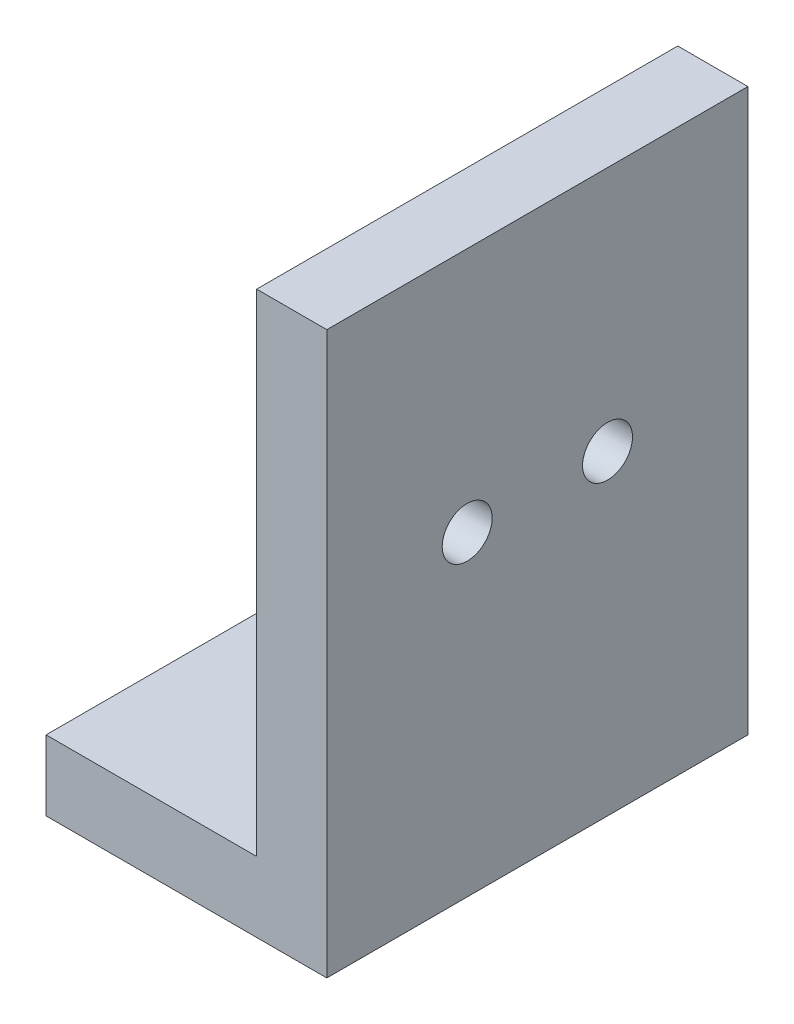
ISO-10303-21;
HEADER;
FILE_DESCRIPTION(('STEP AP214'),'2;1');
FILE_NAME('part.step','',(''),(''),'','','');
FILE_SCHEMA(('AUTOMOTIVE_DESIGN { 1 0 10303 214 1 1 1 1 }'));
ENDSEC;
DATA;
#1=APPLICATION_CONTEXT('core data for automotive mechanical design processes');
#2=APPLICATION_PROTOCOL_DEFINITION('international standard','automotive_design',2000,#1);
#3=PRODUCT_CONTEXT('',#1,'mechanical');
#4=PRODUCT('Part','Part','',(#3));
#5=PRODUCT_RELATED_PRODUCT_CATEGORY('part','',(#4));
#6=PRODUCT_DEFINITION_FORMATION('','',#4);
#7=PRODUCT_DEFINITION_CONTEXT('part definition',#1,'design');
#8=PRODUCT_DEFINITION('design','',#6,#7);
#9=PRODUCT_DEFINITION_SHAPE('','',#8);
#10=(LENGTH_UNIT() NAMED_UNIT(*) SI_UNIT(.MILLI.,.METRE.));
#11=(NAMED_UNIT(*) PLANE_ANGLE_UNIT() SI_UNIT($,.RADIAN.));
#12=(NAMED_UNIT(*) SI_UNIT($,.STERADIAN.) SOLID_ANGLE_UNIT());
#13=UNCERTAINTY_MEASURE_WITH_UNIT(LENGTH_MEASURE(1.E-05),#10,'distance_accuracy_value','');
#14=(GEOMETRIC_REPRESENTATION_CONTEXT(3) GLOBAL_UNCERTAINTY_ASSIGNED_CONTEXT((#13)) GLOBAL_UNIT_ASSIGNED_CONTEXT((#10,
#11,#12)) REPRESENTATION_CONTEXT('',''));
#15=CARTESIAN_POINT('',(0.,0.,0.));
#16=DIRECTION('',(0.,0.,1.));
#17=DIRECTION('',(1.,0.,0.));
#18=AXIS2_PLACEMENT_3D('',#15,#16,#17);
#19=CARTESIAN_POINT('',(0.,0.,19.05));
#20=DIRECTION('',(0.,1.,0.));
#21=DIRECTION('',(0.,0.,1.));
#22=AXIS2_PLACEMENT_3D('',#19,#20,#21);
#23=PLANE('',#22);
#24=CARTESIAN_POINT('',(4.7625,0.,6.35));
#25=DIRECTION('',(0.,1.,0.));
#26=DIRECTION('',(0.,0.,1.));
#27=AXIS2_PLACEMENT_3D('',#24,#25,#26);
#28=CIRCLE('',#27,1.13029999999999);
#29=CARTESIAN_POINT('',(4.7625,0.,7.48029999999999));
#30=VERTEX_POINT('',#29);
#31=EDGE_CURVE('E164',#30,#30,#28,.T.);
#32=ORIENTED_EDGE('',*,*,#31,.T.);
#33=EDGE_LOOP('',(#32));
#34=FACE_BOUND('',#33,.T.);
#35=CARTESIAN_POINT('',(4.7625,0.,12.7));
#36=DIRECTION('',(0.,1.,0.));
#37=DIRECTION('',(0.,0.,1.));
#38=AXIS2_PLACEMENT_3D('',#35,#36,#37);
#39=CIRCLE('',#38,1.13029999999999);
#40=CARTESIAN_POINT('',(4.7625,0.,13.8303));
#41=VERTEX_POINT('',#40);
#42=EDGE_CURVE('E167',#41,#41,#39,.T.);
#43=ORIENTED_EDGE('',*,*,#42,.T.);
#44=EDGE_LOOP('',(#43));
#45=FACE_BOUND('',#44,.T.);
#46=DIRECTION('',(1.,0.,0.));
#47=VECTOR('',#46,1.);
#48=CARTESIAN_POINT('',(0.,0.,0.));
#49=LINE('',#48,#47);
#50=CARTESIAN_POINT('',(0.,0.,0.));
#51=VERTEX_POINT('',#50);
#52=CARTESIAN_POINT('',(12.7,0.,0.));
#53=VERTEX_POINT('',#52);
#54=EDGE_CURVE('E117',#51,#53,#49,.T.);
#55=ORIENTED_EDGE('',*,*,#54,.T.);
#56=DIRECTION('',(0.,0.,-1.));
#57=VECTOR('',#56,1.);
#58=CARTESIAN_POINT('',(12.7,0.,19.05));
#59=LINE('',#58,#57);
#60=CARTESIAN_POINT('',(12.7,0.,19.05));
#61=VERTEX_POINT('',#60);
#62=EDGE_CURVE('E11',#61,#53,#59,.T.);
#63=ORIENTED_EDGE('',*,*,#62,.F.);
#64=DIRECTION('',(1.,0.,0.));
#65=VECTOR('',#64,1.);
#66=CARTESIAN_POINT('',(0.,0.,19.05));
#67=LINE('',#66,#65);
#68=CARTESIAN_POINT('',(0.,0.,19.05));
#69=VERTEX_POINT('',#68);
#70=EDGE_CURVE('E128',#69,#61,#67,.T.);
#71=ORIENTED_EDGE('',*,*,#70,.F.);
#72=DIRECTION('',(0.,0.,-1.));
#73=VECTOR('',#72,1.);
#74=CARTESIAN_POINT('',(0.,0.,19.05));
#75=LINE('',#74,#73);
#76=EDGE_CURVE('E113',#69,#51,#75,.T.);
#77=ORIENTED_EDGE('',*,*,#76,.T.);
#78=EDGE_LOOP('',(#55,#63,#71,#77));
#79=FACE_BOUND('',#78,.T.);
#80=ADVANCED_FACE('F33',(#34,#45,#79),#23,.F.);
#81=CARTESIAN_POINT('',(12.7,0.,19.05));
#82=DIRECTION('',(-1.,0.,0.));
#83=DIRECTION('',(0.,0.,1.));
#84=AXIS2_PLACEMENT_3D('',#81,#82,#83);
#85=PLANE('',#84);
#86=CARTESIAN_POINT('',(12.7,14.2875,6.35));
#87=DIRECTION('',(-1.,0.,0.));
#88=DIRECTION('',(0.,0.,1.));
#89=AXIS2_PLACEMENT_3D('',#86,#87,#88);
#90=CIRCLE('',#89,1.1303);
#91=CARTESIAN_POINT('',(12.7,14.2875,7.4803));
#92=VERTEX_POINT('',#91);
#93=EDGE_CURVE('E173',#92,#92,#90,.T.);
#94=ORIENTED_EDGE('',*,*,#93,.T.);
#95=EDGE_LOOP('',(#94));
#96=FACE_BOUND('',#95,.T.);
#97=CARTESIAN_POINT('',(12.7,14.2875,12.7));
#98=DIRECTION('',(-1.,0.,0.));
#99=DIRECTION('',(0.,0.,1.));
#100=AXIS2_PLACEMENT_3D('',#97,#98,#99);
#101=CIRCLE('',#100,1.1303);
#102=CARTESIAN_POINT('',(12.7,14.2875,13.8303));
#103=VERTEX_POINT('',#102);
#104=EDGE_CURVE('E121',#103,#103,#101,.T.);
#105=ORIENTED_EDGE('',*,*,#104,.T.);
#106=EDGE_LOOP('',(#105));
#107=FACE_BOUND('',#106,.T.);
#108=DIRECTION('',(0.,1.,0.));
#109=VECTOR('',#108,1.);
#110=CARTESIAN_POINT('',(12.7,0.,0.));
#111=LINE('',#110,#109);
#112=CARTESIAN_POINT('',(12.7,25.4,0.));
#113=VERTEX_POINT('',#112);
#114=EDGE_CURVE('E120',#53,#113,#111,.T.);
#115=ORIENTED_EDGE('',*,*,#114,.T.);
#116=DIRECTION('',(0.,0.,-1.));
#117=VECTOR('',#116,1.);
#118=CARTESIAN_POINT('',(12.7,25.4,19.05));
#119=LINE('',#118,#117);
#120=CARTESIAN_POINT('',(12.7,25.4,19.05));
#121=VERTEX_POINT('',#120);
#122=EDGE_CURVE('E41',#121,#113,#119,.T.);
#123=ORIENTED_EDGE('',*,*,#122,.F.);
#124=DIRECTION('',(0.,1.,0.));
#125=VECTOR('',#124,1.);
#126=CARTESIAN_POINT('',(12.7,0.,19.05));
#127=LINE('',#126,#125);
#128=EDGE_CURVE('E86',#61,#121,#127,.T.);
#129=ORIENTED_EDGE('',*,*,#128,.F.);
#130=ORIENTED_EDGE('',*,*,#62,.T.);
#131=EDGE_LOOP('',(#115,#123,#129,#130));
#132=FACE_BOUND('',#131,.T.);
#133=ADVANCED_FACE('F154',(#96,#107,#132),#85,.F.);
#134=CARTESIAN_POINT('',(12.7,25.4,19.05));
#135=DIRECTION('',(0.,-1.,0.));
#136=DIRECTION('',(0.,0.,-1.));
#137=AXIS2_PLACEMENT_3D('',#134,#135,#136);
#138=PLANE('',#137);
#139=DIRECTION('',(-1.,0.,0.));
#140=VECTOR('',#139,1.);
#141=CARTESIAN_POINT('',(12.7,25.4,0.));
#142=LINE('',#141,#140);
#143=CARTESIAN_POINT('',(9.525,25.4,0.));
#144=VERTEX_POINT('',#143);
#145=EDGE_CURVE('E123',#113,#144,#142,.T.);
#146=ORIENTED_EDGE('',*,*,#145,.T.);
#147=DIRECTION('',(0.,0.,-1.));
#148=VECTOR('',#147,1.);
#149=CARTESIAN_POINT('',(9.525,25.4,19.05));
#150=LINE('',#149,#148);
#151=CARTESIAN_POINT('',(9.525,25.4,19.05));
#152=VERTEX_POINT('',#151);
#153=EDGE_CURVE('E108',#152,#144,#150,.T.);
#154=ORIENTED_EDGE('',*,*,#153,.F.);
#155=DIRECTION('',(-1.,0.,0.));
#156=VECTOR('',#155,1.);
#157=CARTESIAN_POINT('',(12.7,25.4,19.05));
#158=LINE('',#157,#156);
#159=EDGE_CURVE('E99',#121,#152,#158,.T.);
#160=ORIENTED_EDGE('',*,*,#159,.F.);
#161=ORIENTED_EDGE('',*,*,#122,.T.);
#162=EDGE_LOOP('',(#146,#154,#160,#161));
#163=FACE_BOUND('',#162,.T.);
#164=ADVANCED_FACE('F134',(#163),#138,.F.);
#165=CARTESIAN_POINT('',(9.525,25.4,19.05));
#166=DIRECTION('',(1.,0.,0.));
#167=DIRECTION('',(0.,1.,0.));
#168=AXIS2_PLACEMENT_3D('',#165,#166,#167);
#169=PLANE('',#168);
#170=CARTESIAN_POINT('',(9.525,14.2875,6.35));
#171=DIRECTION('',(-1.,0.,0.));
#172=DIRECTION('',(0.,0.,1.));
#173=AXIS2_PLACEMENT_3D('',#170,#171,#172);
#174=CIRCLE('',#173,1.1303);
#175=CARTESIAN_POINT('',(9.525,14.2875,7.4803));
#176=VERTEX_POINT('',#175);
#177=EDGE_CURVE('E169',#176,#176,#174,.T.);
#178=ORIENTED_EDGE('',*,*,#177,.F.);
#179=EDGE_LOOP('',(#178));
#180=FACE_BOUND('',#179,.T.);
#181=CARTESIAN_POINT('',(9.525,14.2875,12.7));
#182=DIRECTION('',(-1.,0.,0.));
#183=DIRECTION('',(0.,0.,1.));
#184=AXIS2_PLACEMENT_3D('',#181,#182,#183);
#185=CIRCLE('',#184,1.1303);
#186=CARTESIAN_POINT('',(9.525,14.2875,13.8303));
#187=VERTEX_POINT('',#186);
#188=EDGE_CURVE('E181',#187,#187,#185,.T.);
#189=ORIENTED_EDGE('',*,*,#188,.F.);
#190=EDGE_LOOP('',(#189));
#191=FACE_BOUND('',#190,.T.);
#192=DIRECTION('',(0.,-1.,0.));
#193=VECTOR('',#192,1.);
#194=CARTESIAN_POINT('',(9.525,25.4,0.));
#195=LINE('',#194,#193);
#196=CARTESIAN_POINT('',(9.525,3.175,0.));
#197=VERTEX_POINT('',#196);
#198=EDGE_CURVE('E107',#144,#197,#195,.T.);
#199=ORIENTED_EDGE('',*,*,#198,.T.);
#200=DIRECTION('',(0.,0.,-1.));
#201=VECTOR('',#200,1.);
#202=CARTESIAN_POINT('',(9.525,3.175,19.05));
#203=LINE('',#202,#201);
#204=CARTESIAN_POINT('',(9.525,3.175,19.05));
#205=VERTEX_POINT('',#204);
#206=EDGE_CURVE('E104',#205,#197,#203,.T.);
#207=ORIENTED_EDGE('',*,*,#206,.F.);
#208=DIRECTION('',(0.,-1.,0.));
#209=VECTOR('',#208,1.);
#210=CARTESIAN_POINT('',(9.525,25.4,19.05));
#211=LINE('',#210,#209);
#212=EDGE_CURVE('E93',#152,#205,#211,.T.);
#213=ORIENTED_EDGE('',*,*,#212,.F.);
#214=ORIENTED_EDGE('',*,*,#153,.T.);
#215=EDGE_LOOP('',(#199,#207,#213,#214));
#216=FACE_BOUND('',#215,.T.);
#217=ADVANCED_FACE('F105',(#180,#191,#216),#169,.F.);
#218=CARTESIAN_POINT('',(9.525,3.175,19.05));
#219=DIRECTION('',(0.,-1.,0.));
#220=DIRECTION('',(1.,0.,0.));
#221=AXIS2_PLACEMENT_3D('',#218,#219,#220);
#222=PLANE('',#221);
#223=CARTESIAN_POINT('',(4.7625,3.175,6.35));
#224=DIRECTION('',(0.,1.,0.));
#225=DIRECTION('',(0.,0.,1.));
#226=AXIS2_PLACEMENT_3D('',#223,#224,#225);
#227=CIRCLE('',#226,1.13029999999999);
#228=CARTESIAN_POINT('',(4.7625,3.175,7.48029999999999));
#229=VERTEX_POINT('',#228);
#230=EDGE_CURVE('E214',#229,#229,#227,.T.);
#231=ORIENTED_EDGE('',*,*,#230,.F.);
#232=EDGE_LOOP('',(#231));
#233=FACE_BOUND('',#232,.T.);
#234=CARTESIAN_POINT('',(4.7625,3.175,12.7));
#235=DIRECTION('',(0.,1.,0.));
#236=DIRECTION('',(0.,0.,1.));
#237=AXIS2_PLACEMENT_3D('',#234,#235,#236);
#238=CIRCLE('',#237,1.13029999999999);
#239=CARTESIAN_POINT('',(4.7625,3.175,13.8303));
#240=VERTEX_POINT('',#239);
#241=EDGE_CURVE('E170',#240,#240,#238,.T.);
#242=ORIENTED_EDGE('',*,*,#241,.F.);
#243=EDGE_LOOP('',(#242));
#244=FACE_BOUND('',#243,.T.);
#245=DIRECTION('',(-1.,0.,0.));
#246=VECTOR('',#245,1.);
#247=CARTESIAN_POINT('',(9.525,3.175,0.));
#248=LINE('',#247,#246);
#249=CARTESIAN_POINT('',(0.,3.175,0.));
#250=VERTEX_POINT('',#249);
#251=EDGE_CURVE('E72',#197,#250,#248,.T.);
#252=ORIENTED_EDGE('',*,*,#251,.T.);
#253=DIRECTION('',(0.,0.,-1.));
#254=VECTOR('',#253,1.);
#255=CARTESIAN_POINT('',(0.,3.175,19.05));
#256=LINE('',#255,#254);
#257=CARTESIAN_POINT('',(0.,3.175,19.05));
#258=VERTEX_POINT('',#257);
#259=EDGE_CURVE('E109',#258,#250,#256,.T.);
#260=ORIENTED_EDGE('',*,*,#259,.F.);
#261=DIRECTION('',(-1.,0.,0.));
#262=VECTOR('',#261,1.);
#263=CARTESIAN_POINT('',(9.525,3.175,19.05));
#264=LINE('',#263,#262);
#265=EDGE_CURVE('E97',#205,#258,#264,.T.);
#266=ORIENTED_EDGE('',*,*,#265,.F.);
#267=ORIENTED_EDGE('',*,*,#206,.T.);
#268=EDGE_LOOP('',(#252,#260,#266,#267));
#269=FACE_BOUND('',#268,.T.);
#270=ADVANCED_FACE('F111',(#233,#244,#269),#222,.F.);
#271=CARTESIAN_POINT('',(0.,3.175,19.05));
#272=DIRECTION('',(1.,0.,0.));
#273=DIRECTION('',(0.,1.,0.));
#274=AXIS2_PLACEMENT_3D('',#271,#272,#273);
#275=PLANE('',#274);
#276=DIRECTION('',(0.,-1.,0.));
#277=VECTOR('',#276,1.);
#278=CARTESIAN_POINT('',(0.,3.175,0.));
#279=LINE('',#278,#277);
#280=EDGE_CURVE('E78',#250,#51,#279,.T.);
#281=ORIENTED_EDGE('',*,*,#280,.T.);
#282=ORIENTED_EDGE('',*,*,#76,.F.);
#283=DIRECTION('',(0.,-1.,0.));
#284=VECTOR('',#283,1.);
#285=CARTESIAN_POINT('',(0.,3.175,19.05));
#286=LINE('',#285,#284);
#287=EDGE_CURVE('E49',#258,#69,#286,.T.);
#288=ORIENTED_EDGE('',*,*,#287,.F.);
#289=ORIENTED_EDGE('',*,*,#259,.T.);
#290=EDGE_LOOP('',(#281,#282,#288,#289));
#291=FACE_BOUND('',#290,.T.);
#292=ADVANCED_FACE('F141',(#291),#275,.F.);
#293=CARTESIAN_POINT('',(0.,0.,19.05));
#294=DIRECTION('',(0.,0.,1.));
#295=DIRECTION('',(1.,0.,0.));
#296=AXIS2_PLACEMENT_3D('',#293,#294,#295);
#297=PLANE('',#296);
#298=ORIENTED_EDGE('',*,*,#70,.T.);
#299=ORIENTED_EDGE('',*,*,#128,.T.);
#300=ORIENTED_EDGE('',*,*,#159,.T.);
#301=ORIENTED_EDGE('',*,*,#212,.T.);
#302=ORIENTED_EDGE('',*,*,#265,.T.);
#303=ORIENTED_EDGE('',*,*,#287,.T.);
#304=EDGE_LOOP('',(#298,#299,#300,#301,#302,#303));
#305=FACE_BOUND('',#304,.T.);
#306=ADVANCED_FACE('F95',(#305),#297,.T.);
#307=CARTESIAN_POINT('',(0.,0.,0.));
#308=DIRECTION('',(0.,0.,1.));
#309=DIRECTION('',(1.,0.,0.));
#310=AXIS2_PLACEMENT_3D('',#307,#308,#309);
#311=PLANE('',#310);
#312=ORIENTED_EDGE('',*,*,#54,.F.);
#313=ORIENTED_EDGE('',*,*,#280,.F.);
#314=ORIENTED_EDGE('',*,*,#251,.F.);
#315=ORIENTED_EDGE('',*,*,#198,.F.);
#316=ORIENTED_EDGE('',*,*,#145,.F.);
#317=ORIENTED_EDGE('',*,*,#114,.F.);
#318=EDGE_LOOP('',(#312,#313,#314,#315,#316,#317));
#319=FACE_BOUND('',#318,.T.);
#320=ADVANCED_FACE('F137',(#319),#311,.F.);
#321=CARTESIAN_POINT('',(9.525,14.2875,12.7));
#322=DIRECTION('',(-1.,0.,0.));
#323=DIRECTION('',(0.,0.,1.));
#324=AXIS2_PLACEMENT_3D('',#321,#322,#323);
#325=CYLINDRICAL_SURFACE('',#324,1.1303);
#326=ORIENTED_EDGE('',*,*,#188,.T.);
#327=EDGE_LOOP('',(#326));
#328=FACE_BOUND('',#327,.T.);
#329=ORIENTED_EDGE('',*,*,#104,.F.);
#330=EDGE_LOOP('',(#329));
#331=FACE_BOUND('',#330,.T.);
#332=ADVANCED_FACE('F190',(#328,#331),#325,.F.);
#333=CARTESIAN_POINT('',(9.525,14.2875,6.35));
#334=DIRECTION('',(-1.,0.,0.));
#335=DIRECTION('',(0.,0.,1.));
#336=AXIS2_PLACEMENT_3D('',#333,#334,#335);
#337=CYLINDRICAL_SURFACE('',#336,1.1303);
#338=ORIENTED_EDGE('',*,*,#177,.T.);
#339=EDGE_LOOP('',(#338));
#340=FACE_BOUND('',#339,.T.);
#341=ORIENTED_EDGE('',*,*,#93,.F.);
#342=EDGE_LOOP('',(#341));
#343=FACE_BOUND('',#342,.T.);
#344=ADVANCED_FACE('F192',(#340,#343),#337,.F.);
#345=CARTESIAN_POINT('',(4.7625,3.175,12.7));
#346=DIRECTION('',(0.,1.,0.));
#347=DIRECTION('',(0.,0.,1.));
#348=AXIS2_PLACEMENT_3D('',#345,#346,#347);
#349=CYLINDRICAL_SURFACE('',#348,1.13029999999999);
#350=ORIENTED_EDGE('',*,*,#241,.T.);
#351=EDGE_LOOP('',(#350));
#352=FACE_BOUND('',#351,.T.);
#353=ORIENTED_EDGE('',*,*,#42,.F.);
#354=EDGE_LOOP('',(#353));
#355=FACE_BOUND('',#354,.T.);
#356=ADVANCED_FACE('F199',(#352,#355),#349,.F.);
#357=CARTESIAN_POINT('',(4.7625,3.175,6.35));
#358=DIRECTION('',(0.,1.,0.));
#359=DIRECTION('',(0.,0.,1.));
#360=AXIS2_PLACEMENT_3D('',#357,#358,#359);
#361=CYLINDRICAL_SURFACE('',#360,1.13029999999999);
#362=ORIENTED_EDGE('',*,*,#230,.T.);
#363=EDGE_LOOP('',(#362));
#364=FACE_BOUND('',#363,.T.);
#365=ORIENTED_EDGE('',*,*,#31,.F.);
#366=EDGE_LOOP('',(#365));
#367=FACE_BOUND('',#366,.T.);
#368=ADVANCED_FACE('F205',(#364,#367),#361,.F.);
#369=CLOSED_SHELL('',(#80,#133,#164,#217,#270,#292,#306,#320,#332,#344,#356,#368));
#370=MANIFOLD_SOLID_BREP('B2',#369);
#371=ADVANCED_BREP_SHAPE_REPRESENTATION('',(#18,#370),#14);
#372=SHAPE_DEFINITION_REPRESENTATION(#9,#371);
ENDSEC;
END-ISO-10303-21;
